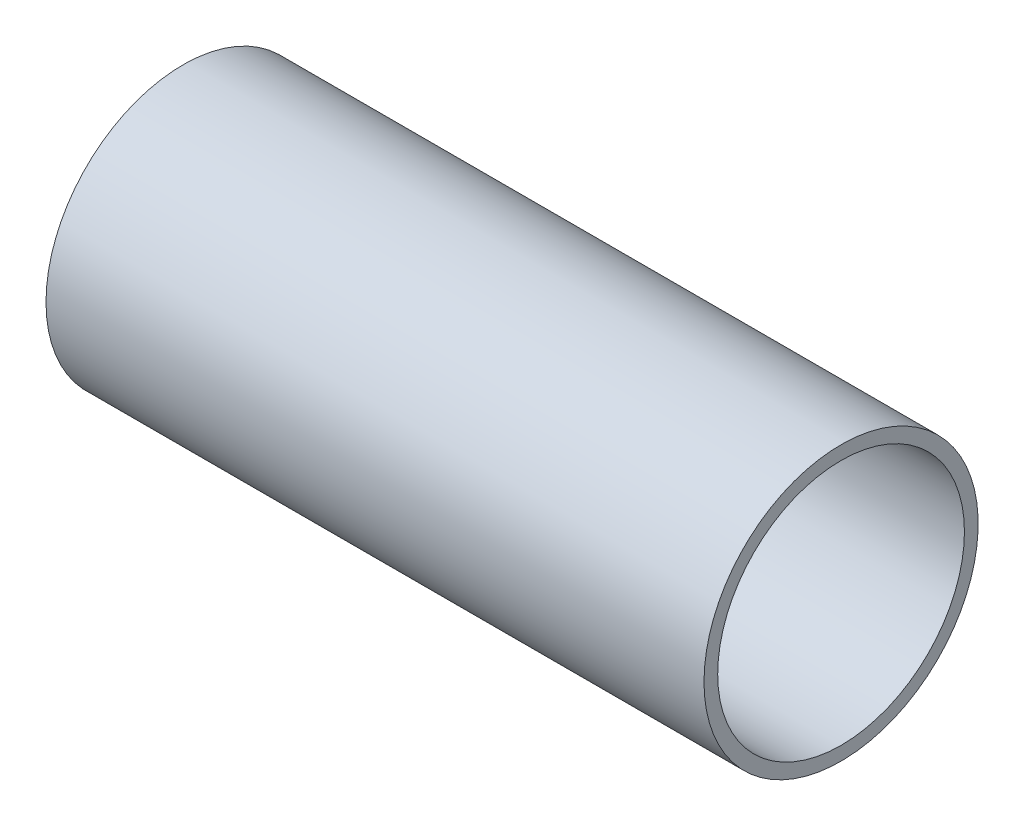
ISO-10303-21;
HEADER;
FILE_DESCRIPTION(('STEP AP214'),'2;1');
FILE_NAME('part.step','',(''),(''),'','','');
FILE_SCHEMA(('AUTOMOTIVE_DESIGN { 1 0 10303 214 1 1 1 1 }'));
ENDSEC;
DATA;
#1=APPLICATION_CONTEXT('core data for automotive mechanical design processes');
#2=APPLICATION_PROTOCOL_DEFINITION('international standard','automotive_design',2000,#1);
#3=PRODUCT_CONTEXT('',#1,'mechanical');
#4=PRODUCT('Part','Part','',(#3));
#5=PRODUCT_RELATED_PRODUCT_CATEGORY('part','',(#4));
#6=PRODUCT_DEFINITION_FORMATION('','',#4);
#7=PRODUCT_DEFINITION_CONTEXT('part definition',#1,'design');
#8=PRODUCT_DEFINITION('design','',#6,#7);
#9=PRODUCT_DEFINITION_SHAPE('','',#8);
#10=(LENGTH_UNIT() NAMED_UNIT(*) SI_UNIT(.MILLI.,.METRE.));
#11=(NAMED_UNIT(*) PLANE_ANGLE_UNIT() SI_UNIT($,.RADIAN.));
#12=(NAMED_UNIT(*) SI_UNIT($,.STERADIAN.) SOLID_ANGLE_UNIT());
#13=UNCERTAINTY_MEASURE_WITH_UNIT(LENGTH_MEASURE(1.E-05),#10,'distance_accuracy_value','');
#14=(GEOMETRIC_REPRESENTATION_CONTEXT(3) GLOBAL_UNCERTAINTY_ASSIGNED_CONTEXT((#13)) GLOBAL_UNIT_ASSIGNED_CONTEXT((#10,
#11,#12)) REPRESENTATION_CONTEXT('',''));
#15=CARTESIAN_POINT('',(0.,0.,0.));
#16=DIRECTION('',(0.,0.,1.));
#17=DIRECTION('',(1.,0.,0.));
#18=AXIS2_PLACEMENT_3D('',#15,#16,#17);
#19=CARTESIAN_POINT('',(76.2,0.,0.));
#20=DIRECTION('',(1.,0.,0.));
#21=DIRECTION('',(0.,0.,-1.));
#22=AXIS2_PLACEMENT_3D('',#19,#20,#21);
#23=PLANE('',#22);
#24=CARTESIAN_POINT('',(76.2,0.,0.));
#25=DIRECTION('',(1.,0.,0.));
#26=DIRECTION('',(0.,0.,-1.));
#27=AXIS2_PLACEMENT_3D('',#24,#25,#26);
#28=CIRCLE('',#27,15.875);
#29=CARTESIAN_POINT('',(76.2,0.,15.875));
#30=VERTEX_POINT('',#29);
#31=EDGE_CURVE('E10',#30,#30,#28,.T.);
#32=ORIENTED_EDGE('',*,*,#31,.T.);
#33=EDGE_LOOP('',(#32));
#34=FACE_BOUND('',#33,.T.);
#35=CARTESIAN_POINT('',(76.2,0.,0.));
#36=DIRECTION('',(1.,0.,0.));
#37=DIRECTION('',(0.,0.,-1.));
#38=AXIS2_PLACEMENT_3D('',#35,#36,#37);
#39=CIRCLE('',#38,14.2875);
#40=CARTESIAN_POINT('',(76.2,0.,14.2875));
#41=VERTEX_POINT('',#40);
#42=EDGE_CURVE('E44',#41,#41,#39,.T.);
#43=ORIENTED_EDGE('',*,*,#42,.F.);
#44=EDGE_LOOP('',(#43));
#45=FACE_BOUND('',#44,.T.);
#46=ADVANCED_FACE('F32',(#34,#45),#23,.T.);
#47=CARTESIAN_POINT('',(0.,0.,0.));
#48=DIRECTION('',(1.,0.,0.));
#49=DIRECTION('',(0.,0.,-1.));
#50=AXIS2_PLACEMENT_3D('',#47,#48,#49);
#51=PLANE('',#50);
#52=CARTESIAN_POINT('',(0.,0.,0.));
#53=DIRECTION('',(1.,0.,0.));
#54=DIRECTION('',(0.,0.,-1.));
#55=AXIS2_PLACEMENT_3D('',#52,#53,#54);
#56=CIRCLE('',#55,15.875);
#57=CARTESIAN_POINT('',(0.,0.,15.875));
#58=VERTEX_POINT('',#57);
#59=EDGE_CURVE('E36',#58,#58,#56,.T.);
#60=ORIENTED_EDGE('',*,*,#59,.F.);
#61=EDGE_LOOP('',(#60));
#62=FACE_BOUND('',#61,.T.);
#63=CARTESIAN_POINT('',(0.,0.,0.));
#64=DIRECTION('',(1.,0.,0.));
#65=DIRECTION('',(0.,0.,-1.));
#66=AXIS2_PLACEMENT_3D('',#63,#64,#65);
#67=CIRCLE('',#66,14.2875);
#68=CARTESIAN_POINT('',(0.,0.,14.2875));
#69=VERTEX_POINT('',#68);
#70=EDGE_CURVE('E46',#69,#69,#67,.T.);
#71=ORIENTED_EDGE('',*,*,#70,.T.);
#72=EDGE_LOOP('',(#71));
#73=FACE_BOUND('',#72,.T.);
#74=ADVANCED_FACE('F60',(#62,#73),#51,.F.);
#75=CARTESIAN_POINT('',(76.2,0.,0.));
#76=DIRECTION('',(-1.,0.,0.));
#77=DIRECTION('',(0.,0.,1.));
#78=AXIS2_PLACEMENT_3D('',#75,#76,#77);
#79=CYLINDRICAL_SURFACE('',#78,15.875);
#80=CARTESIAN_POINT('',(76.2,0.,15.875));
#81=CARTESIAN_POINT('',(75.40625,0.,15.875));
#82=CARTESIAN_POINT('',(74.6125,0.,15.875));
#83=CARTESIAN_POINT('',(73.025,0.,15.875));
#84=CARTESIAN_POINT('',(72.23125,0.,15.875));
#85=CARTESIAN_POINT('',(70.64375,0.,15.875));
#86=CARTESIAN_POINT('',(69.85,0.,15.875));
#87=CARTESIAN_POINT('',(68.2625,0.,15.875));
#88=CARTESIAN_POINT('',(67.46875,0.,15.875));
#89=CARTESIAN_POINT('',(65.88125,0.,15.875));
#90=CARTESIAN_POINT('',(65.0875,0.,15.875));
#91=CARTESIAN_POINT('',(63.5,0.,15.875));
#92=CARTESIAN_POINT('',(62.70625,0.,15.875));
#93=CARTESIAN_POINT('',(61.11875,0.,15.875));
#94=CARTESIAN_POINT('',(60.325,0.,15.875));
#95=CARTESIAN_POINT('',(58.7375,0.,15.875));
#96=CARTESIAN_POINT('',(57.94375,0.,15.875));
#97=CARTESIAN_POINT('',(56.35625,0.,15.875));
#98=CARTESIAN_POINT('',(55.5625,0.,15.875));
#99=CARTESIAN_POINT('',(53.975,0.,15.875));
#100=CARTESIAN_POINT('',(53.18125,0.,15.875));
#101=CARTESIAN_POINT('',(51.59375,0.,15.875));
#102=CARTESIAN_POINT('',(50.8,0.,15.875));
#103=CARTESIAN_POINT('',(49.2125,0.,15.875));
#104=CARTESIAN_POINT('',(48.41875,0.,15.875));
#105=CARTESIAN_POINT('',(46.83125,0.,15.875));
#106=CARTESIAN_POINT('',(46.0375,0.,15.875));
#107=CARTESIAN_POINT('',(44.45,0.,15.875));
#108=CARTESIAN_POINT('',(43.65625,0.,15.875));
#109=CARTESIAN_POINT('',(42.06875,0.,15.875));
#110=CARTESIAN_POINT('',(41.275,0.,15.875));
#111=CARTESIAN_POINT('',(39.6875,0.,15.875));
#112=CARTESIAN_POINT('',(38.89375,0.,15.875));
#113=CARTESIAN_POINT('',(37.30625,0.,15.875));
#114=CARTESIAN_POINT('',(36.5125,0.,15.875));
#115=CARTESIAN_POINT('',(34.925,0.,15.875));
#116=CARTESIAN_POINT('',(34.13125,0.,15.875));
#117=CARTESIAN_POINT('',(32.54375,0.,15.875));
#118=CARTESIAN_POINT('',(31.75,0.,15.875));
#119=CARTESIAN_POINT('',(30.1625,0.,15.875));
#120=CARTESIAN_POINT('',(29.36875,0.,15.875));
#121=CARTESIAN_POINT('',(27.78125,0.,15.875));
#122=CARTESIAN_POINT('',(26.9875,0.,15.875));
#123=CARTESIAN_POINT('',(25.4,0.,15.875));
#124=CARTESIAN_POINT('',(24.60625,0.,15.875));
#125=CARTESIAN_POINT('',(23.01875,0.,15.875));
#126=CARTESIAN_POINT('',(22.225,0.,15.875));
#127=CARTESIAN_POINT('',(20.6375,0.,15.875));
#128=CARTESIAN_POINT('',(19.84375,0.,15.875));
#129=CARTESIAN_POINT('',(18.25625,0.,15.875));
#130=CARTESIAN_POINT('',(17.4625,0.,15.875));
#131=CARTESIAN_POINT('',(15.875,0.,15.875));
#132=CARTESIAN_POINT('',(15.08125,0.,15.875));
#133=CARTESIAN_POINT('',(13.49375,0.,15.875));
#134=CARTESIAN_POINT('',(12.7,0.,15.875));
#135=CARTESIAN_POINT('',(11.1125,0.,15.875));
#136=CARTESIAN_POINT('',(10.31875,0.,15.875));
#137=CARTESIAN_POINT('',(8.73125,0.,15.875));
#138=CARTESIAN_POINT('',(7.93750000000001,0.,15.875));
#139=CARTESIAN_POINT('',(6.35,0.,15.875));
#140=CARTESIAN_POINT('',(5.55625,0.,15.875));
#141=CARTESIAN_POINT('',(3.96875,0.,15.875));
#142=CARTESIAN_POINT('',(3.175,0.,15.875));
#143=CARTESIAN_POINT('',(1.5875,0.,15.875));
#144=CARTESIAN_POINT('',(0.793750000000001,0.,15.875));
#145=CARTESIAN_POINT('',(0.,0.,15.875));
#146=B_SPLINE_CURVE_WITH_KNOTS('',3,(#80,#81,#82,#83,#84,#85,#86,#87,#88,#89,#90,#91,#92,#93,
#94,#95,#96,#97,#98,#99,#100,#101,#102,#103,#104,#105,#106,#107,#108,#109,#110,#111,#112,#113,
#114,#115,#116,#117,#118,#119,#120,#121,#122,#123,#124,#125,#126,#127,#128,#129,#130,#131,#132,
#133,#134,#135,#136,#137,#138,#139,#140,#141,#142,#143,#144,#145),.UNSPECIFIED.,.F.,.F.,(4,2,2,
2,2,2,2,2,2,2,2,2,2,2,2,2,2,2,2,2,2,2,2,2,2,2,2,2,2,2,2,2,4),(0.,2.38125,4.7625,7.14375,
9.52500000000001,11.90625,14.2875,16.66875,19.05,21.43125,23.8125,26.19375,28.575,30.95625,
33.3375,35.71875,38.1,40.48125,42.8625,45.24375,47.625,50.00625,52.3875,54.76875,57.15,59.53125,
61.9125,64.29375,66.675,69.05625,71.4375,73.81875,76.2),.UNSPECIFIED.);
#147=EDGE_CURVE('BSEAM34',#30,#58,#146,.T.);
#148=ORIENTED_EDGE('',*,*,#31,.F.);
#149=ORIENTED_EDGE('',*,*,#59,.T.);
#150=ORIENTED_EDGE('',*,*,#147,.T.);
#151=ORIENTED_EDGE('',*,*,#147,.F.);
#152=EDGE_LOOP('',(#148,#150,#149,#151));
#153=FACE_BOUND('',#152,.T.);
#154=ADVANCED_FACE('F34',(#153),#79,.T.);
#155=CARTESIAN_POINT('',(76.2,0.,0.));
#156=DIRECTION('',(-1.,0.,0.));
#157=DIRECTION('',(0.,0.,1.));
#158=AXIS2_PLACEMENT_3D('',#155,#156,#157);
#159=CYLINDRICAL_SURFACE('',#158,14.2875);
#160=CARTESIAN_POINT('',(76.2,0.,14.2875));
#161=CARTESIAN_POINT('',(75.40625,0.,14.2875));
#162=CARTESIAN_POINT('',(74.6125,0.,14.2875));
#163=CARTESIAN_POINT('',(73.025,0.,14.2875));
#164=CARTESIAN_POINT('',(72.23125,0.,14.2875));
#165=CARTESIAN_POINT('',(70.64375,0.,14.2875));
#166=CARTESIAN_POINT('',(69.85,0.,14.2875));
#167=CARTESIAN_POINT('',(68.2625,0.,14.2875));
#168=CARTESIAN_POINT('',(67.46875,0.,14.2875));
#169=CARTESIAN_POINT('',(65.88125,0.,14.2875));
#170=CARTESIAN_POINT('',(65.0875,0.,14.2875));
#171=CARTESIAN_POINT('',(63.5,0.,14.2875));
#172=CARTESIAN_POINT('',(62.70625,0.,14.2875));
#173=CARTESIAN_POINT('',(61.11875,0.,14.2875));
#174=CARTESIAN_POINT('',(60.325,0.,14.2875));
#175=CARTESIAN_POINT('',(58.7375,0.,14.2875));
#176=CARTESIAN_POINT('',(57.94375,0.,14.2875));
#177=CARTESIAN_POINT('',(56.35625,0.,14.2875));
#178=CARTESIAN_POINT('',(55.5625,0.,14.2875));
#179=CARTESIAN_POINT('',(53.975,0.,14.2875));
#180=CARTESIAN_POINT('',(53.18125,0.,14.2875));
#181=CARTESIAN_POINT('',(51.59375,0.,14.2875));
#182=CARTESIAN_POINT('',(50.8,0.,14.2875));
#183=CARTESIAN_POINT('',(49.2125,0.,14.2875));
#184=CARTESIAN_POINT('',(48.41875,0.,14.2875));
#185=CARTESIAN_POINT('',(46.83125,0.,14.2875));
#186=CARTESIAN_POINT('',(46.0375,0.,14.2875));
#187=CARTESIAN_POINT('',(44.45,0.,14.2875));
#188=CARTESIAN_POINT('',(43.65625,0.,14.2875));
#189=CARTESIAN_POINT('',(42.06875,0.,14.2875));
#190=CARTESIAN_POINT('',(41.275,0.,14.2875));
#191=CARTESIAN_POINT('',(39.6875,0.,14.2875));
#192=CARTESIAN_POINT('',(38.89375,0.,14.2875));
#193=CARTESIAN_POINT('',(37.30625,0.,14.2875));
#194=CARTESIAN_POINT('',(36.5125,0.,14.2875));
#195=CARTESIAN_POINT('',(34.925,0.,14.2875));
#196=CARTESIAN_POINT('',(34.13125,0.,14.2875));
#197=CARTESIAN_POINT('',(32.54375,0.,14.2875));
#198=CARTESIAN_POINT('',(31.75,0.,14.2875));
#199=CARTESIAN_POINT('',(30.1625,0.,14.2875));
#200=CARTESIAN_POINT('',(29.36875,0.,14.2875));
#201=CARTESIAN_POINT('',(27.78125,0.,14.2875));
#202=CARTESIAN_POINT('',(26.9875,0.,14.2875));
#203=CARTESIAN_POINT('',(25.4,0.,14.2875));
#204=CARTESIAN_POINT('',(24.60625,0.,14.2875));
#205=CARTESIAN_POINT('',(23.01875,0.,14.2875));
#206=CARTESIAN_POINT('',(22.225,0.,14.2875));
#207=CARTESIAN_POINT('',(20.6375,0.,14.2875));
#208=CARTESIAN_POINT('',(19.84375,0.,14.2875));
#209=CARTESIAN_POINT('',(18.25625,0.,14.2875));
#210=CARTESIAN_POINT('',(17.4625,0.,14.2875));
#211=CARTESIAN_POINT('',(15.875,0.,14.2875));
#212=CARTESIAN_POINT('',(15.08125,0.,14.2875));
#213=CARTESIAN_POINT('',(13.49375,0.,14.2875));
#214=CARTESIAN_POINT('',(12.7,0.,14.2875));
#215=CARTESIAN_POINT('',(11.1125,0.,14.2875));
#216=CARTESIAN_POINT('',(10.31875,0.,14.2875));
#217=CARTESIAN_POINT('',(8.73125,0.,14.2875));
#218=CARTESIAN_POINT('',(7.93750000000001,0.,14.2875));
#219=CARTESIAN_POINT('',(6.35,0.,14.2875));
#220=CARTESIAN_POINT('',(5.55625,0.,14.2875));
#221=CARTESIAN_POINT('',(3.96875,0.,14.2875));
#222=CARTESIAN_POINT('',(3.175,0.,14.2875));
#223=CARTESIAN_POINT('',(1.5875,0.,14.2875));
#224=CARTESIAN_POINT('',(0.793750000000001,0.,14.2875));
#225=CARTESIAN_POINT('',(0.,0.,14.2875));
#226=B_SPLINE_CURVE_WITH_KNOTS('',3,(#160,#161,#162,#163,#164,#165,#166,#167,#168,#169,#170,
#171,#172,#173,#174,#175,#176,#177,#178,#179,#180,#181,#182,#183,#184,#185,#186,#187,#188,#189,
#190,#191,#192,#193,#194,#195,#196,#197,#198,#199,#200,#201,#202,#203,#204,#205,#206,#207,#208,
#209,#210,#211,#212,#213,#214,#215,#216,#217,#218,#219,#220,#221,#222,#223,#224,#225),
.UNSPECIFIED.,.F.,.F.,(4,2,2,2,2,2,2,2,2,2,2,2,2,2,2,2,2,2,2,2,2,2,2,2,2,2,2,2,2,2,2,2,4),(0.,
2.38125,4.7625,7.14375,9.52500000000001,11.90625,14.2875,16.66875,19.05,21.43125,23.8125,
26.19375,28.575,30.95625,33.3375,35.71875,38.1,40.48125,42.8625,45.24375,47.625,50.00625,
52.3875,54.76875,57.15,59.53125,61.9125,64.29375,66.675,69.05625,71.4375,73.81875,76.2),.UNSPECIFIED.);
#227=EDGE_CURVE('BSEAM56',#41,#69,#226,.T.);
#228=ORIENTED_EDGE('',*,*,#42,.T.);
#229=ORIENTED_EDGE('',*,*,#70,.F.);
#230=ORIENTED_EDGE('',*,*,#227,.T.);
#231=ORIENTED_EDGE('',*,*,#227,.F.);
#232=EDGE_LOOP('',(#228,#230,#229,#231));
#233=FACE_BOUND('',#232,.T.);
#234=ADVANCED_FACE('F56',(#233),#159,.F.);
#235=CLOSED_SHELL('',(#46,#74,#154,#234));
#236=MANIFOLD_SOLID_BREP('B2',#235);
#237=ADVANCED_BREP_SHAPE_REPRESENTATION('',(#18,#236),#14);
#238=SHAPE_DEFINITION_REPRESENTATION(#9,#237);
ENDSEC;
END-ISO-10303-21;
